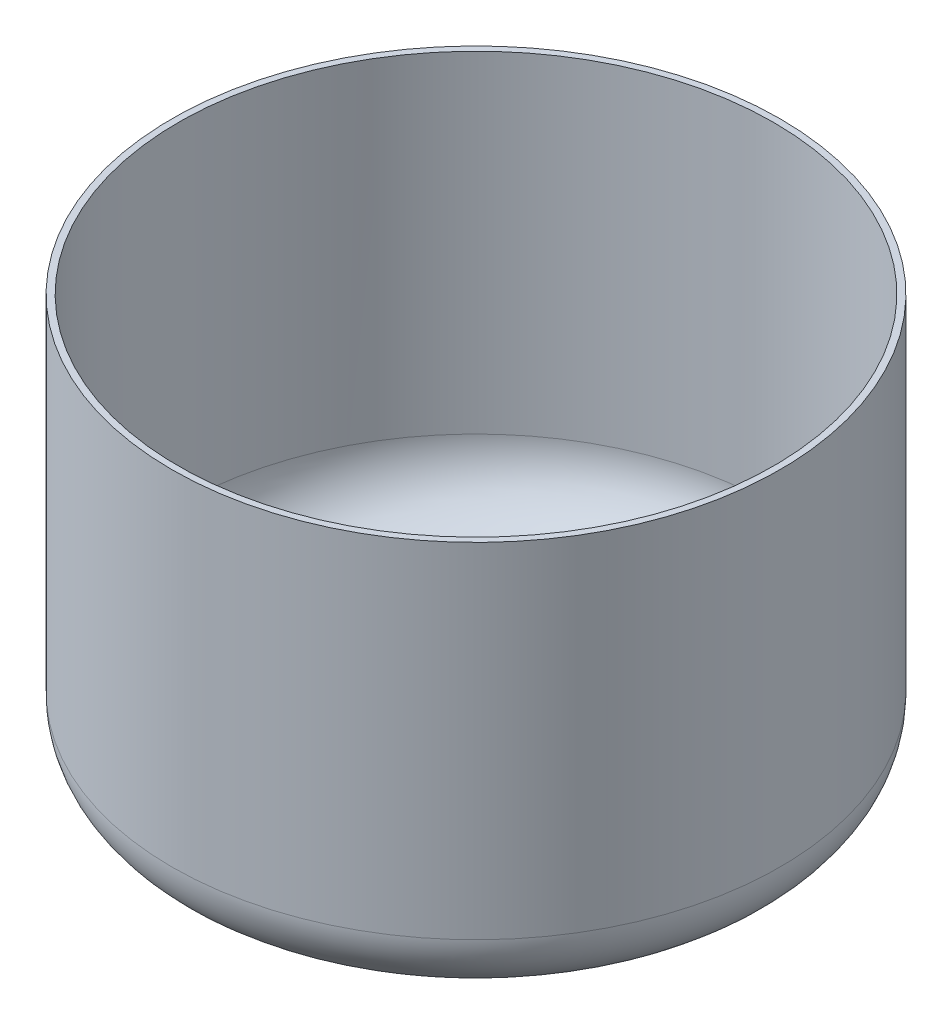
ISO-10303-21;
HEADER;
FILE_DESCRIPTION(('STEP AP214'),'2;1');
FILE_NAME('part.step','',(''),(''),'','','');
FILE_SCHEMA(('AUTOMOTIVE_DESIGN { 1 0 10303 214 1 1 1 1 }'));
ENDSEC;
DATA;
#1=APPLICATION_CONTEXT('core data for automotive mechanical design processes');
#2=APPLICATION_PROTOCOL_DEFINITION('international standard','automotive_design',2000,#1);
#3=PRODUCT_CONTEXT('',#1,'mechanical');
#4=PRODUCT('Part','Part','',(#3));
#5=PRODUCT_RELATED_PRODUCT_CATEGORY('part','',(#4));
#6=PRODUCT_DEFINITION_FORMATION('','',#4);
#7=PRODUCT_DEFINITION_CONTEXT('part definition',#1,'design');
#8=PRODUCT_DEFINITION('design','',#6,#7);
#9=PRODUCT_DEFINITION_SHAPE('','',#8);
#10=(LENGTH_UNIT() NAMED_UNIT(*) SI_UNIT(.MILLI.,.METRE.));
#11=(NAMED_UNIT(*) PLANE_ANGLE_UNIT() SI_UNIT($,.RADIAN.));
#12=(NAMED_UNIT(*) SI_UNIT($,.STERADIAN.) SOLID_ANGLE_UNIT());
#13=UNCERTAINTY_MEASURE_WITH_UNIT(LENGTH_MEASURE(1.E-05),#10,'distance_accuracy_value','');
#14=(GEOMETRIC_REPRESENTATION_CONTEXT(3) GLOBAL_UNCERTAINTY_ASSIGNED_CONTEXT((#13)) GLOBAL_UNIT_ASSIGNED_CONTEXT((#10,
#11,#12)) REPRESENTATION_CONTEXT('',''));
#15=CARTESIAN_POINT('',(0.,0.,0.));
#16=DIRECTION('',(0.,0.,1.));
#17=DIRECTION('',(1.,0.,0.));
#18=AXIS2_PLACEMENT_3D('',#15,#16,#17);
#19=CARTESIAN_POINT('',(0.,0.,0.));
#20=DIRECTION('',(0.,-1.,0.));
#21=DIRECTION('',(0.,0.,-1.));
#22=AXIS2_PLACEMENT_3D('',#19,#20,#21);
#23=CYLINDRICAL_SURFACE('',#22,120.65);
#24=CARTESIAN_POINT('',(0.,-54.6,0.));
#25=DIRECTION('',(0.,-1.,0.));
#26=DIRECTION('',(0.,0.,-1.));
#27=AXIS2_PLACEMENT_3D('',#24,#25,#26);
#28=CIRCLE('',#27,120.65);
#29=CARTESIAN_POINT('',(0.,-54.6,-120.65));
#30=VERTEX_POINT('',#29);
#31=EDGE_CURVE('E10',#30,#30,#28,.F.);
#32=ORIENTED_EDGE('',*,*,#31,.T.);
#33=EDGE_LOOP('',(#32));
#34=FACE_BOUND('',#33,.T.);
#35=CARTESIAN_POINT('',(0.,81.972,0.));
#36=DIRECTION('',(0.,-1.,0.));
#37=DIRECTION('',(0.,0.,-1.));
#38=AXIS2_PLACEMENT_3D('',#35,#36,#37);
#39=CIRCLE('',#38,120.65);
#40=CARTESIAN_POINT('',(0.,81.972,-120.65));
#41=VERTEX_POINT('',#40);
#42=EDGE_CURVE('E71',#41,#41,#39,.T.);
#43=ORIENTED_EDGE('',*,*,#42,.T.);
#44=EDGE_LOOP('',(#43));
#45=FACE_BOUND('',#44,.T.);
#46=ADVANCED_FACE('F34',(#34,#45),#23,.T.);
#47=CARTESIAN_POINT('',(120.65,-80.,0.));
#48=DIRECTION('',(0.,-1.,0.));
#49=DIRECTION('',(0.,0.,-1.));
#50=AXIS2_PLACEMENT_3D('',#47,#48,#49);
#51=PLANE('',#50);
#52=CARTESIAN_POINT('',(0.,-80.,0.));
#53=DIRECTION('',(0.,-1.,0.));
#54=DIRECTION('',(0.,0.,-1.));
#55=AXIS2_PLACEMENT_3D('',#52,#53,#54);
#56=CIRCLE('',#55,95.25);
#57=CARTESIAN_POINT('',(0.,-80.,-95.25));
#58=VERTEX_POINT('',#57);
#59=EDGE_CURVE('E41',#58,#58,#56,.T.);
#60=ORIENTED_EDGE('',*,*,#59,.T.);
#61=EDGE_LOOP('',(#60));
#62=FACE_BOUND('',#61,.T.);
#63=CARTESIAN_POINT('',(0.,-80.,63.5));
#64=DIRECTION('',(0.,-1.,0.));
#65=DIRECTION('',(0.,0.,-1.));
#66=AXIS2_PLACEMENT_3D('',#63,#64,#65);
#67=CIRCLE('',#66,3.25);
#68=CARTESIAN_POINT('',(0.,-80.,60.25));
#69=VERTEX_POINT('',#68);
#70=EDGE_CURVE('E68',#69,#69,#67,.T.);
#71=ORIENTED_EDGE('',*,*,#70,.F.);
#72=EDGE_LOOP('',(#71));
#73=FACE_BOUND('',#72,.T.);
#74=CARTESIAN_POINT('',(0.,-80.,-63.5));
#75=DIRECTION('',(0.,-1.,0.));
#76=DIRECTION('',(0.,0.,-1.));
#77=AXIS2_PLACEMENT_3D('',#74,#75,#76);
#78=CIRCLE('',#77,3.25);
#79=CARTESIAN_POINT('',(0.,-80.,-66.75));
#80=VERTEX_POINT('',#79);
#81=EDGE_CURVE('E85',#80,#80,#78,.T.);
#82=ORIENTED_EDGE('',*,*,#81,.F.);
#83=EDGE_LOOP('',(#82));
#84=FACE_BOUND('',#83,.T.);
#85=CARTESIAN_POINT('',(63.5,-80.,0.));
#86=DIRECTION('',(0.,-1.,0.));
#87=DIRECTION('',(0.,0.,-1.));
#88=AXIS2_PLACEMENT_3D('',#85,#86,#87);
#89=CIRCLE('',#88,3.25000000000001);
#90=CARTESIAN_POINT('',(63.5,-80.,-3.25000000000001));
#91=VERTEX_POINT('',#90);
#92=EDGE_CURVE('E82',#91,#91,#89,.T.);
#93=ORIENTED_EDGE('',*,*,#92,.F.);
#94=EDGE_LOOP('',(#93));
#95=FACE_BOUND('',#94,.T.);
#96=CARTESIAN_POINT('',(-63.5,-80.,0.));
#97=DIRECTION('',(0.,-1.,0.));
#98=DIRECTION('',(0.,0.,-1.));
#99=AXIS2_PLACEMENT_3D('',#96,#97,#98);
#100=CIRCLE('',#99,3.25);
#101=CARTESIAN_POINT('',(-63.5,-80.,-3.25));
#102=VERTEX_POINT('',#101);
#103=EDGE_CURVE('E79',#102,#102,#100,.T.);
#104=ORIENTED_EDGE('',*,*,#103,.F.);
#105=EDGE_LOOP('',(#104));
#106=FACE_BOUND('',#105,.T.);
#107=CARTESIAN_POINT('',(0.,-80.,0.));
#108=DIRECTION('',(0.,-1.,0.));
#109=DIRECTION('',(0.,0.,-1.));
#110=AXIS2_PLACEMENT_3D('',#107,#108,#109);
#111=CIRCLE('',#110,18.415);
#112=CARTESIAN_POINT('',(0.,-80.,-18.415));
#113=VERTEX_POINT('',#112);
#114=EDGE_CURVE('E74',#113,#113,#111,.T.);
#115=ORIENTED_EDGE('',*,*,#114,.F.);
#116=EDGE_LOOP('',(#115));
#117=FACE_BOUND('',#116,.T.);
#118=ADVANCED_FACE('F93',(#62,#73,#84,#95,#106,#117),#51,.T.);
#119=CARTESIAN_POINT('',(118.11,-75.,0.));
#120=DIRECTION('',(0.,1.,0.));
#121=DIRECTION('',(0.,0.,1.));
#122=AXIS2_PLACEMENT_3D('',#119,#120,#121);
#123=PLANE('',#122);
#124=CARTESIAN_POINT('',(0.,-75.,0.));
#125=DIRECTION('',(0.,1.,0.));
#126=DIRECTION('',(0.,0.,1.));
#127=AXIS2_PLACEMENT_3D('',#124,#125,#126);
#128=CIRCLE('',#127,92.71);
#129=CARTESIAN_POINT('',(0.,-75.,92.71));
#130=VERTEX_POINT('',#129);
#131=EDGE_CURVE('E45',#130,#130,#128,.T.);
#132=ORIENTED_EDGE('',*,*,#131,.T.);
#133=EDGE_LOOP('',(#132));
#134=FACE_BOUND('',#133,.T.);
#135=CARTESIAN_POINT('',(0.,-75.,63.5));
#136=DIRECTION('',(0.,1.,0.));
#137=DIRECTION('',(0.,0.,1.));
#138=AXIS2_PLACEMENT_3D('',#135,#136,#137);
#139=CIRCLE('',#138,3.25);
#140=CARTESIAN_POINT('',(0.,-75.,66.75));
#141=VERTEX_POINT('',#140);
#142=EDGE_CURVE('E55',#141,#141,#139,.T.);
#143=ORIENTED_EDGE('',*,*,#142,.F.);
#144=EDGE_LOOP('',(#143));
#145=FACE_BOUND('',#144,.T.);
#146=CARTESIAN_POINT('',(0.,-75.,-63.5));
#147=DIRECTION('',(0.,1.,0.));
#148=DIRECTION('',(0.,0.,1.));
#149=AXIS2_PLACEMENT_3D('',#146,#147,#148);
#150=CIRCLE('',#149,3.25);
#151=CARTESIAN_POINT('',(0.,-75.,-60.25));
#152=VERTEX_POINT('',#151);
#153=EDGE_CURVE('E59',#152,#152,#150,.T.);
#154=ORIENTED_EDGE('',*,*,#153,.F.);
#155=EDGE_LOOP('',(#154));
#156=FACE_BOUND('',#155,.T.);
#157=CARTESIAN_POINT('',(63.5,-75.,0.));
#158=DIRECTION('',(0.,1.,0.));
#159=DIRECTION('',(0.,0.,1.));
#160=AXIS2_PLACEMENT_3D('',#157,#158,#159);
#161=CIRCLE('',#160,3.25000000000001);
#162=CARTESIAN_POINT('',(63.5,-75.,3.25000000000001));
#163=VERTEX_POINT('',#162);
#164=EDGE_CURVE('E62',#163,#163,#161,.T.);
#165=ORIENTED_EDGE('',*,*,#164,.F.);
#166=EDGE_LOOP('',(#165));
#167=FACE_BOUND('',#166,.T.);
#168=CARTESIAN_POINT('',(-63.5,-75.,0.));
#169=DIRECTION('',(0.,1.,0.));
#170=DIRECTION('',(0.,0.,1.));
#171=AXIS2_PLACEMENT_3D('',#168,#169,#170);
#172=CIRCLE('',#171,3.25);
#173=CARTESIAN_POINT('',(-63.5,-75.,3.25));
#174=VERTEX_POINT('',#173);
#175=EDGE_CURVE('E65',#174,#174,#172,.T.);
#176=ORIENTED_EDGE('',*,*,#175,.F.);
#177=EDGE_LOOP('',(#176));
#178=FACE_BOUND('',#177,.T.);
#179=CARTESIAN_POINT('',(0.,-75.,0.));
#180=DIRECTION('',(0.,1.,0.));
#181=DIRECTION('',(0.,0.,1.));
#182=AXIS2_PLACEMENT_3D('',#179,#180,#181);
#183=CIRCLE('',#182,18.415);
#184=CARTESIAN_POINT('',(0.,-75.,18.415));
#185=VERTEX_POINT('',#184);
#186=EDGE_CURVE('E58',#185,#185,#183,.F.);
#187=ORIENTED_EDGE('',*,*,#186,.T.);
#188=EDGE_LOOP('',(#187));
#189=FACE_BOUND('',#188,.T.);
#190=ADVANCED_FACE('F96',(#134,#145,#156,#167,#178,#189),#123,.T.);
#191=CARTESIAN_POINT('',(0.,0.,0.));
#192=DIRECTION('',(0.,-1.,0.));
#193=DIRECTION('',(0.,0.,-1.));
#194=AXIS2_PLACEMENT_3D('',#191,#192,#193);
#195=CYLINDRICAL_SURFACE('',#194,118.11);
#196=CARTESIAN_POINT('',(0.,-49.6,0.));
#197=DIRECTION('',(0.,1.,0.));
#198=DIRECTION('',(0.,0.,1.));
#199=AXIS2_PLACEMENT_3D('',#196,#197,#198);
#200=CIRCLE('',#199,118.11);
#201=CARTESIAN_POINT('',(0.,-49.6,118.11));
#202=VERTEX_POINT('',#201);
#203=EDGE_CURVE('E49',#202,#202,#200,.F.);
#204=ORIENTED_EDGE('',*,*,#203,.T.);
#205=EDGE_LOOP('',(#204));
#206=FACE_BOUND('',#205,.T.);
#207=CARTESIAN_POINT('',(0.,81.972,0.));
#208=DIRECTION('',(0.,-1.,0.));
#209=DIRECTION('',(0.,0.,-1.));
#210=AXIS2_PLACEMENT_3D('',#207,#208,#209);
#211=CIRCLE('',#210,118.11);
#212=CARTESIAN_POINT('',(0.,81.972,-118.11));
#213=VERTEX_POINT('',#212);
#214=EDGE_CURVE('E54',#213,#213,#211,.T.);
#215=ORIENTED_EDGE('',*,*,#214,.F.);
#216=EDGE_LOOP('',(#215));
#217=FACE_BOUND('',#216,.T.);
#218=ADVANCED_FACE('F119',(#206,#217),#195,.F.);
#219=CARTESIAN_POINT('',(118.11,81.972,0.));
#220=DIRECTION('',(0.,1.,0.));
#221=DIRECTION('',(0.,0.,1.));
#222=AXIS2_PLACEMENT_3D('',#219,#220,#221);
#223=PLANE('',#222);
#224=ORIENTED_EDGE('',*,*,#214,.T.);
#225=EDGE_LOOP('',(#224));
#226=FACE_BOUND('',#225,.T.);
#227=ORIENTED_EDGE('',*,*,#42,.F.);
#228=EDGE_LOOP('',(#227));
#229=FACE_BOUND('',#228,.T.);
#230=ADVANCED_FACE('F109',(#226,#229),#223,.T.);
#231=CARTESIAN_POINT('',(0.,81.973,0.));
#232=DIRECTION('',(0.,-1.,0.));
#233=DIRECTION('',(0.,0.,-1.));
#234=AXIS2_PLACEMENT_3D('',#231,#232,#233);
#235=CYLINDRICAL_SURFACE('',#234,18.415);
#236=ORIENTED_EDGE('',*,*,#186,.F.);
#237=EDGE_LOOP('',(#236));
#238=FACE_BOUND('',#237,.T.);
#239=ORIENTED_EDGE('',*,*,#114,.T.);
#240=EDGE_LOOP('',(#239));
#241=FACE_BOUND('',#240,.T.);
#242=ADVANCED_FACE('F106',(#238,#241),#235,.F.);
#243=CARTESIAN_POINT('',(-63.5,81.972,0.));
#244=DIRECTION('',(0.,-1.,0.));
#245=DIRECTION('',(0.,0.,-1.));
#246=AXIS2_PLACEMENT_3D('',#243,#244,#245);
#247=CYLINDRICAL_SURFACE('',#246,3.25);
#248=ORIENTED_EDGE('',*,*,#175,.T.);
#249=EDGE_LOOP('',(#248));
#250=FACE_BOUND('',#249,.T.);
#251=ORIENTED_EDGE('',*,*,#103,.T.);
#252=EDGE_LOOP('',(#251));
#253=FACE_BOUND('',#252,.T.);
#254=ADVANCED_FACE('F108',(#250,#253),#247,.F.);
#255=CARTESIAN_POINT('',(63.5,81.972,0.));
#256=DIRECTION('',(0.,-1.,0.));
#257=DIRECTION('',(0.,0.,-1.));
#258=AXIS2_PLACEMENT_3D('',#255,#256,#257);
#259=CYLINDRICAL_SURFACE('',#258,3.25000000000001);
#260=ORIENTED_EDGE('',*,*,#164,.T.);
#261=EDGE_LOOP('',(#260));
#262=FACE_BOUND('',#261,.T.);
#263=ORIENTED_EDGE('',*,*,#92,.T.);
#264=EDGE_LOOP('',(#263));
#265=FACE_BOUND('',#264,.T.);
#266=ADVANCED_FACE('F116',(#262,#265),#259,.F.);
#267=CARTESIAN_POINT('',(0.,81.972,-63.5));
#268=DIRECTION('',(0.,-1.,0.));
#269=DIRECTION('',(0.,0.,-1.));
#270=AXIS2_PLACEMENT_3D('',#267,#268,#269);
#271=CYLINDRICAL_SURFACE('',#270,3.25);
#272=ORIENTED_EDGE('',*,*,#153,.T.);
#273=EDGE_LOOP('',(#272));
#274=FACE_BOUND('',#273,.T.);
#275=ORIENTED_EDGE('',*,*,#81,.T.);
#276=EDGE_LOOP('',(#275));
#277=FACE_BOUND('',#276,.T.);
#278=ADVANCED_FACE('F137',(#274,#277),#271,.F.);
#279=CARTESIAN_POINT('',(0.,81.972,63.5));
#280=DIRECTION('',(0.,-1.,0.));
#281=DIRECTION('',(0.,0.,-1.));
#282=AXIS2_PLACEMENT_3D('',#279,#280,#281);
#283=CYLINDRICAL_SURFACE('',#282,3.25);
#284=ORIENTED_EDGE('',*,*,#142,.T.);
#285=EDGE_LOOP('',(#284));
#286=FACE_BOUND('',#285,.T.);
#287=ORIENTED_EDGE('',*,*,#70,.T.);
#288=EDGE_LOOP('',(#287));
#289=FACE_BOUND('',#288,.T.);
#290=ADVANCED_FACE('F91',(#286,#289),#283,.F.);
#291=CARTESIAN_POINT('',(0.,-49.6,0.));
#292=DIRECTION('',(0.,1.,0.));
#293=DIRECTION('',(0.,0.,1.));
#294=AXIS2_PLACEMENT_3D('',#291,#292,#293);
#295=TOROIDAL_SURFACE('',#294,92.71,25.4);
#296=ORIENTED_EDGE('',*,*,#131,.F.);
#297=EDGE_LOOP('',(#296));
#298=FACE_BOUND('',#297,.T.);
#299=ORIENTED_EDGE('',*,*,#203,.F.);
#300=EDGE_LOOP('',(#299));
#301=FACE_BOUND('',#300,.T.);
#302=ADVANCED_FACE('F129',(#298,#301),#295,.F.);
#303=CARTESIAN_POINT('',(0.,-54.6,0.));
#304=DIRECTION('',(0.,-1.,0.));
#305=DIRECTION('',(0.,0.,-1.));
#306=AXIS2_PLACEMENT_3D('',#303,#304,#305);
#307=TOROIDAL_SURFACE('',#306,95.25,25.4);
#308=ORIENTED_EDGE('',*,*,#31,.F.);
#309=EDGE_LOOP('',(#308));
#310=FACE_BOUND('',#309,.T.);
#311=ORIENTED_EDGE('',*,*,#59,.F.);
#312=EDGE_LOOP('',(#311));
#313=FACE_BOUND('',#312,.T.);
#314=ADVANCED_FACE('F36',(#310,#313),#307,.T.);
#315=CLOSED_SHELL('',(#46,#118,#190,#218,#230,#242,#254,#266,#278,#290,#302,#314));
#316=MANIFOLD_SOLID_BREP('B2',#315);
#317=ADVANCED_BREP_SHAPE_REPRESENTATION('',(#18,#316),#14);
#318=SHAPE_DEFINITION_REPRESENTATION(#9,#317);
ENDSEC;
END-ISO-10303-21;
